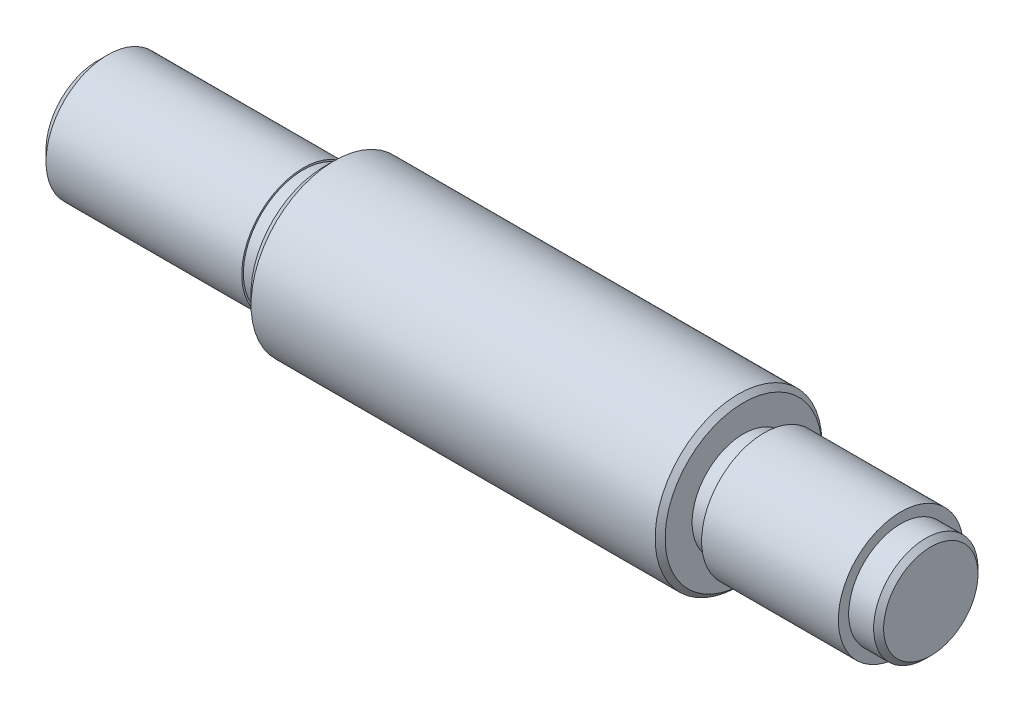
ISO-10303-21;
HEADER;
FILE_DESCRIPTION(('STEP AP214'),'2;1');
FILE_NAME('part.step','',(''),(''),'','','');
FILE_SCHEMA(('AUTOMOTIVE_DESIGN { 1 0 10303 214 1 1 1 1 }'));
ENDSEC;
DATA;
#1=APPLICATION_CONTEXT('core data for automotive mechanical design processes');
#2=APPLICATION_PROTOCOL_DEFINITION('international standard','automotive_design',2000,#1);
#3=PRODUCT_CONTEXT('',#1,'mechanical');
#4=PRODUCT('Part','Part','',(#3));
#5=PRODUCT_RELATED_PRODUCT_CATEGORY('part','',(#4));
#6=PRODUCT_DEFINITION_FORMATION('','',#4);
#7=PRODUCT_DEFINITION_CONTEXT('part definition',#1,'design');
#8=PRODUCT_DEFINITION('design','',#6,#7);
#9=PRODUCT_DEFINITION_SHAPE('','',#8);
#10=(LENGTH_UNIT() NAMED_UNIT(*) SI_UNIT(.MILLI.,.METRE.));
#11=(NAMED_UNIT(*) PLANE_ANGLE_UNIT() SI_UNIT($,.RADIAN.));
#12=(NAMED_UNIT(*) SI_UNIT($,.STERADIAN.) SOLID_ANGLE_UNIT());
#13=UNCERTAINTY_MEASURE_WITH_UNIT(LENGTH_MEASURE(1.E-05),#10,'distance_accuracy_value','');
#14=(GEOMETRIC_REPRESENTATION_CONTEXT(3) GLOBAL_UNCERTAINTY_ASSIGNED_CONTEXT((#13)) GLOBAL_UNIT_ASSIGNED_CONTEXT((#10,
#11,#12)) REPRESENTATION_CONTEXT('',''));
#15=CARTESIAN_POINT('',(0.,0.,0.));
#16=DIRECTION('',(0.,0.,1.));
#17=DIRECTION('',(1.,0.,0.));
#18=AXIS2_PLACEMENT_3D('',#15,#16,#17);
#19=CARTESIAN_POINT('',(19.05,0.,0.));
#20=DIRECTION('',(1.,0.,0.));
#21=DIRECTION('',(0.,0.,-1.));
#22=AXIS2_PLACEMENT_3D('',#19,#20,#21);
#23=CYLINDRICAL_SURFACE('',#22,4.7625);
#24=CARTESIAN_POINT('',(19.05,0.,0.));
#25=DIRECTION('',(1.,0.,0.));
#26=DIRECTION('',(0.,0.,-1.));
#27=AXIS2_PLACEMENT_3D('',#24,#25,#26);
#28=CIRCLE('',#27,4.7625);
#29=CARTESIAN_POINT('',(19.05,0.,-4.7625));
#30=VERTEX_POINT('',#29);
#31=EDGE_CURVE('E97',#30,#30,#28,.T.);
#32=ORIENTED_EDGE('',*,*,#31,.T.);
#33=EDGE_LOOP('',(#32));
#34=FACE_BOUND('',#33,.T.);
#35=CARTESIAN_POINT('',(29.464,0.,0.));
#36=DIRECTION('',(1.,0.,0.));
#37=DIRECTION('',(0.,0.,-1.));
#38=AXIS2_PLACEMENT_3D('',#35,#36,#37);
#39=CIRCLE('',#38,4.7625);
#40=CARTESIAN_POINT('',(29.464,0.,-4.7625));
#41=VERTEX_POINT('',#40);
#42=EDGE_CURVE('E102',#41,#41,#39,.T.);
#43=ORIENTED_EDGE('',*,*,#42,.F.);
#44=EDGE_LOOP('',(#43));
#45=FACE_BOUND('',#44,.T.);
#46=ADVANCED_FACE('F50',(#34,#45),#23,.T.);
#47=CARTESIAN_POINT('',(31.75,0.,0.));
#48=DIRECTION('',(-1.,0.,0.));
#49=DIRECTION('',(0.,0.,1.));
#50=AXIS2_PLACEMENT_3D('',#47,#48,#49);
#51=CYLINDRICAL_SURFACE('',#50,3.9116);
#52=CARTESIAN_POINT('',(17.4752,0.,0.));
#53=DIRECTION('',(1.,0.,0.));
#54=DIRECTION('',(0.,0.,-1.));
#55=AXIS2_PLACEMENT_3D('',#52,#53,#54);
#56=CIRCLE('',#55,3.9116);
#57=CARTESIAN_POINT('',(17.4752,0.,-3.9116));
#58=VERTEX_POINT('',#57);
#59=EDGE_CURVE('E84',#58,#58,#56,.T.);
#60=ORIENTED_EDGE('',*,*,#59,.T.);
#61=EDGE_LOOP('',(#60));
#62=FACE_BOUND('',#61,.T.);
#63=CARTESIAN_POINT('',(19.05,0.,0.));
#64=DIRECTION('',(1.,0.,0.));
#65=DIRECTION('',(0.,0.,-1.));
#66=AXIS2_PLACEMENT_3D('',#63,#64,#65);
#67=CIRCLE('',#66,3.9116);
#68=CARTESIAN_POINT('',(19.05,0.,-3.9116));
#69=VERTEX_POINT('',#68);
#70=EDGE_CURVE('E83',#69,#69,#67,.T.);
#71=ORIENTED_EDGE('',*,*,#70,.F.);
#72=EDGE_LOOP('',(#71));
#73=FACE_BOUND('',#72,.T.);
#74=ADVANCED_FACE('F118',(#62,#73),#51,.T.);
#75=CARTESIAN_POINT('',(19.05,0.,0.));
#76=DIRECTION('',(1.,0.,0.));
#77=DIRECTION('',(0.,0.,-1.));
#78=AXIS2_PLACEMENT_3D('',#75,#76,#77);
#79=PLANE('',#78);
#80=ORIENTED_EDGE('',*,*,#70,.T.);
#81=EDGE_LOOP('',(#80));
#82=FACE_BOUND('',#81,.T.);
#83=ORIENTED_EDGE('',*,*,#31,.F.);
#84=EDGE_LOOP('',(#83));
#85=FACE_BOUND('',#84,.T.);
#86=ADVANCED_FACE('F113',(#82,#85),#79,.F.);
#87=CARTESIAN_POINT('',(29.464,0.,0.));
#88=DIRECTION('',(1.,0.,0.));
#89=DIRECTION('',(0.,0.,-1.));
#90=AXIS2_PLACEMENT_3D('',#87,#88,#89);
#91=PLANE('',#90);
#92=CARTESIAN_POINT('',(29.464,0.,0.));
#93=DIRECTION('',(1.,0.,0.));
#94=DIRECTION('',(0.,0.,-1.));
#95=AXIS2_PLACEMENT_3D('',#92,#93,#94);
#96=CIRCLE('',#95,3.9751);
#97=CARTESIAN_POINT('',(29.464,0.,-3.9751));
#98=VERTEX_POINT('',#97);
#99=EDGE_CURVE('E87',#98,#98,#96,.T.);
#100=ORIENTED_EDGE('',*,*,#99,.F.);
#101=EDGE_LOOP('',(#100));
#102=FACE_BOUND('',#101,.T.);
#103=ORIENTED_EDGE('',*,*,#42,.T.);
#104=EDGE_LOOP('',(#103));
#105=FACE_BOUND('',#104,.T.);
#106=ADVANCED_FACE('F110',(#102,#105),#91,.T.);
#107=CARTESIAN_POINT('',(29.464,0.,0.));
#108=DIRECTION('',(1.,0.,0.));
#109=DIRECTION('',(0.,0.,-1.));
#110=AXIS2_PLACEMENT_3D('',#107,#108,#109);
#111=CYLINDRICAL_SURFACE('',#110,3.9751);
#112=CARTESIAN_POINT('',(31.369,0.,0.));
#113=DIRECTION('',(1.,0.,0.));
#114=DIRECTION('',(0.,0.,-1.));
#115=AXIS2_PLACEMENT_3D('',#112,#113,#114);
#116=CIRCLE('',#115,3.9751);
#117=CARTESIAN_POINT('',(31.369,0.,-3.9751));
#118=VERTEX_POINT('',#117);
#119=EDGE_CURVE('E62',#118,#118,#116,.F.);
#120=ORIENTED_EDGE('',*,*,#119,.T.);
#121=EDGE_LOOP('',(#120));
#122=FACE_BOUND('',#121,.T.);
#123=ORIENTED_EDGE('',*,*,#99,.T.);
#124=EDGE_LOOP('',(#123));
#125=FACE_BOUND('',#124,.T.);
#126=ADVANCED_FACE('F108',(#122,#125),#111,.T.);
#127=CARTESIAN_POINT('',(31.75,0.,0.));
#128=DIRECTION('',(1.,0.,0.));
#129=DIRECTION('',(0.,0.,-1.));
#130=AXIS2_PLACEMENT_3D('',#127,#128,#129);
#131=PLANE('',#130);
#132=CARTESIAN_POINT('',(31.75,0.,0.));
#133=DIRECTION('',(1.,0.,0.));
#134=DIRECTION('',(0.,0.,-1.));
#135=AXIS2_PLACEMENT_3D('',#132,#133,#134);
#136=CIRCLE('',#135,3.59410000000002);
#137=CARTESIAN_POINT('',(31.75,0.,-3.59410000000002));
#138=VERTEX_POINT('',#137);
#139=EDGE_CURVE('E66',#138,#138,#136,.T.);
#140=ORIENTED_EDGE('',*,*,#139,.T.);
#141=EDGE_LOOP('',(#140));
#142=FACE_BOUND('',#141,.T.);
#143=ADVANCED_FACE('F142',(#142),#131,.T.);
#144=CARTESIAN_POINT('',(37.0105122421383,0.,0.));
#145=DIRECTION('',(-1.,0.,0.));
#146=DIRECTION('',(0.,0.,1.));
#147=AXIS2_PLACEMENT_3D('',#144,#145,#146);
#148=CYLINDRICAL_SURFACE('',#147,6.35);
#149=CARTESIAN_POINT('',(17.0942,0.,0.));
#150=DIRECTION('',(1.,0.,0.));
#151=DIRECTION('',(0.,0.,-1.));
#152=AXIS2_PLACEMENT_3D('',#149,#150,#151);
#153=CIRCLE('',#152,6.35);
#154=CARTESIAN_POINT('',(17.0942,0.,-6.35));
#155=VERTEX_POINT('',#154);
#156=EDGE_CURVE('E14',#155,#155,#153,.F.);
#157=ORIENTED_EDGE('',*,*,#156,.T.);
#158=EDGE_LOOP('',(#157));
#159=FACE_BOUND('',#158,.T.);
#160=CARTESIAN_POINT('',(-13.6906,0.,0.));
#161=DIRECTION('',(1.,0.,0.));
#162=DIRECTION('',(0.,0.,-1.));
#163=AXIS2_PLACEMENT_3D('',#160,#161,#162);
#164=CIRCLE('',#163,6.35);
#165=CARTESIAN_POINT('',(-13.6906,0.,-6.35));
#166=VERTEX_POINT('',#165);
#167=EDGE_CURVE('E80',#166,#166,#164,.T.);
#168=ORIENTED_EDGE('',*,*,#167,.T.);
#169=EDGE_LOOP('',(#168));
#170=FACE_BOUND('',#169,.T.);
#171=ADVANCED_FACE('F145',(#159,#170),#148,.T.);
#172=CARTESIAN_POINT('',(-14.478,0.,0.));
#173=DIRECTION('',(1.,0.,0.));
#174=DIRECTION('',(0.,0.,-1.));
#175=AXIS2_PLACEMENT_3D('',#172,#173,#174);
#176=PLANE('',#175);
#177=CARTESIAN_POINT('',(-14.478,0.,0.));
#178=DIRECTION('',(1.,0.,0.));
#179=DIRECTION('',(0.,0.,-1.));
#180=AXIS2_PLACEMENT_3D('',#177,#178,#179);
#181=CIRCLE('',#180,5.56259999999999);
#182=CARTESIAN_POINT('',(-14.478,0.,-5.56259999999999));
#183=VERTEX_POINT('',#182);
#184=EDGE_CURVE('E77',#183,#183,#181,.F.);
#185=ORIENTED_EDGE('',*,*,#184,.T.);
#186=EDGE_LOOP('',(#185));
#187=FACE_BOUND('',#186,.T.);
#188=CARTESIAN_POINT('',(-14.478,0.,0.));
#189=DIRECTION('',(1.,0.,0.));
#190=DIRECTION('',(0.,0.,-1.));
#191=AXIS2_PLACEMENT_3D('',#188,#189,#190);
#192=CIRCLE('',#191,4.572);
#193=CARTESIAN_POINT('',(-14.478,0.,-4.572));
#194=VERTEX_POINT('',#193);
#195=EDGE_CURVE('E94',#194,#194,#192,.T.);
#196=ORIENTED_EDGE('',*,*,#195,.T.);
#197=EDGE_LOOP('',(#196));
#198=FACE_BOUND('',#197,.T.);
#199=ADVANCED_FACE('F184',(#187,#198),#176,.F.);
#200=CARTESIAN_POINT('',(17.4752,0.,0.));
#201=DIRECTION('',(1.,0.,0.));
#202=DIRECTION('',(0.,0.,-1.));
#203=AXIS2_PLACEMENT_3D('',#200,#201,#202);
#204=PLANE('',#203);
#205=CARTESIAN_POINT('',(17.4752,0.,0.));
#206=DIRECTION('',(1.,0.,0.));
#207=DIRECTION('',(0.,0.,-1.));
#208=AXIS2_PLACEMENT_3D('',#205,#206,#207);
#209=CIRCLE('',#208,5.96899999999999);
#210=CARTESIAN_POINT('',(17.4752,0.,-5.96899999999999));
#211=VERTEX_POINT('',#210);
#212=EDGE_CURVE('E58',#211,#211,#209,.T.);
#213=ORIENTED_EDGE('',*,*,#212,.T.);
#214=EDGE_LOOP('',(#213));
#215=FACE_BOUND('',#214,.T.);
#216=ORIENTED_EDGE('',*,*,#59,.F.);
#217=EDGE_LOOP('',(#216));
#218=FACE_BOUND('',#217,.T.);
#219=ADVANCED_FACE('F148',(#215,#218),#204,.T.);
#220=CARTESIAN_POINT('',(-31.75,0.,0.));
#221=DIRECTION('',(1.,0.,0.));
#222=DIRECTION('',(0.,0.,-1.));
#223=AXIS2_PLACEMENT_3D('',#220,#221,#222);
#224=PLANE('',#223);
#225=CARTESIAN_POINT('',(-31.75,0.,0.));
#226=DIRECTION('',(1.,0.,0.));
#227=DIRECTION('',(0.,0.,-1.));
#228=AXIS2_PLACEMENT_3D('',#225,#226,#227);
#229=CIRCLE('',#228,3.9116);
#230=CARTESIAN_POINT('',(-31.75,0.,-3.9116));
#231=VERTEX_POINT('',#230);
#232=EDGE_CURVE('E74',#231,#231,#229,.F.);
#233=ORIENTED_EDGE('',*,*,#232,.T.);
#234=EDGE_LOOP('',(#233));
#235=FACE_BOUND('',#234,.T.);
#236=ADVANCED_FACE('F140',(#235),#224,.F.);
#237=CARTESIAN_POINT('',(-14.478,0.,0.));
#238=DIRECTION('',(-1.,0.,0.));
#239=DIRECTION('',(0.,0.,1.));
#240=AXIS2_PLACEMENT_3D('',#237,#238,#239);
#241=CYLINDRICAL_SURFACE('',#240,4.699);
#242=CARTESIAN_POINT('',(-30.9626,0.,0.));
#243=DIRECTION('',(1.,0.,0.));
#244=DIRECTION('',(0.,0.,-1.));
#245=AXIS2_PLACEMENT_3D('',#242,#243,#244);
#246=CIRCLE('',#245,4.699);
#247=CARTESIAN_POINT('',(-30.9626,0.,-4.699));
#248=VERTEX_POINT('',#247);
#249=EDGE_CURVE('E71',#248,#248,#246,.T.);
#250=ORIENTED_EDGE('',*,*,#249,.T.);
#251=EDGE_LOOP('',(#250));
#252=FACE_BOUND('',#251,.T.);
#253=CARTESIAN_POINT('',(-16.0528,0.,0.));
#254=DIRECTION('',(1.,0.,0.));
#255=DIRECTION('',(0.,0.,-1.));
#256=AXIS2_PLACEMENT_3D('',#253,#254,#255);
#257=CIRCLE('',#256,4.699);
#258=CARTESIAN_POINT('',(-16.0528,0.,-4.699));
#259=VERTEX_POINT('',#258);
#260=EDGE_CURVE('E90',#259,#259,#257,.T.);
#261=ORIENTED_EDGE('',*,*,#260,.F.);
#262=EDGE_LOOP('',(#261));
#263=FACE_BOUND('',#262,.T.);
#264=ADVANCED_FACE('F136',(#252,#263),#241,.T.);
#265=CARTESIAN_POINT('',(-16.0528,0.,0.));
#266=DIRECTION('',(1.,0.,0.));
#267=DIRECTION('',(0.,0.,-1.));
#268=AXIS2_PLACEMENT_3D('',#265,#266,#267);
#269=PLANE('',#268);
#270=CARTESIAN_POINT('',(-16.0528,0.,0.));
#271=DIRECTION('',(1.,0.,0.));
#272=DIRECTION('',(0.,0.,-1.));
#273=AXIS2_PLACEMENT_3D('',#270,#271,#272);
#274=CIRCLE('',#273,4.572);
#275=CARTESIAN_POINT('',(-16.0528,0.,-4.572));
#276=VERTEX_POINT('',#275);
#277=EDGE_CURVE('E93',#276,#276,#274,.T.);
#278=ORIENTED_EDGE('',*,*,#277,.F.);
#279=EDGE_LOOP('',(#278));
#280=FACE_BOUND('',#279,.T.);
#281=ORIENTED_EDGE('',*,*,#260,.T.);
#282=EDGE_LOOP('',(#281));
#283=FACE_BOUND('',#282,.T.);
#284=ADVANCED_FACE('F132',(#280,#283),#269,.T.);
#285=CARTESIAN_POINT('',(-16.0528,0.,0.));
#286=DIRECTION('',(1.,0.,0.));
#287=DIRECTION('',(0.,0.,-1.));
#288=AXIS2_PLACEMENT_3D('',#285,#286,#287);
#289=CYLINDRICAL_SURFACE('',#288,4.572);
#290=ORIENTED_EDGE('',*,*,#277,.T.);
#291=EDGE_LOOP('',(#290));
#292=FACE_BOUND('',#291,.T.);
#293=ORIENTED_EDGE('',*,*,#195,.F.);
#294=EDGE_LOOP('',(#293));
#295=FACE_BOUND('',#294,.T.);
#296=ADVANCED_FACE('F128',(#292,#295),#289,.T.);
#297=CARTESIAN_POINT('',(-13.6906,0.,0.));
#298=DIRECTION('',(1.,0.,0.));
#299=DIRECTION('',(0.,0.,-1.));
#300=AXIS2_PLACEMENT_3D('',#297,#298,#299);
#301=CONICAL_SURFACE('',#300,6.35,0.785398163397443);
#302=CARTESIAN_POINT('',(-14.478,0.,-5.56259999999999));
#303=CARTESIAN_POINT('',(-14.4697979166667,0.,-5.57080208333332));
#304=CARTESIAN_POINT('',(-14.4615958333333,0.,-5.57900416666665));
#305=CARTESIAN_POINT('',(-14.4451916666667,0.,-5.59540833333332));
#306=CARTESIAN_POINT('',(-14.4369895833333,0.,-5.60361041666666));
#307=CARTESIAN_POINT('',(-14.4205854166667,0.,-5.62001458333332));
#308=CARTESIAN_POINT('',(-14.4123833333333,0.,-5.62821666666666));
#309=CARTESIAN_POINT('',(-14.3959791666667,0.,-5.64462083333332));
#310=CARTESIAN_POINT('',(-14.3877770833333,0.,-5.65282291666666));
#311=CARTESIAN_POINT('',(-14.3713729166667,0.,-5.66922708333332));
#312=CARTESIAN_POINT('',(-14.3631708333333,0.,-5.67742916666666));
#313=CARTESIAN_POINT('',(-14.3467666666667,0.,-5.69383333333332));
#314=CARTESIAN_POINT('',(-14.3385645833333,0.,-5.70203541666666));
#315=CARTESIAN_POINT('',(-14.3221604166667,0.,-5.71843958333332));
#316=CARTESIAN_POINT('',(-14.3139583333333,0.,-5.72664166666666));
#317=CARTESIAN_POINT('',(-14.2975541666667,0.,-5.74304583333332));
#318=CARTESIAN_POINT('',(-14.2893520833333,0.,-5.75124791666666));
#319=CARTESIAN_POINT('',(-14.2729479166667,0.,-5.76765208333333));
#320=CARTESIAN_POINT('',(-14.2647458333333,0.,-5.77585416666666));
#321=CARTESIAN_POINT('',(-14.2483416666667,0.,-5.79225833333332));
#322=CARTESIAN_POINT('',(-14.2401395833333,0.,-5.80046041666666));
#323=CARTESIAN_POINT('',(-14.2237354166667,0.,-5.81686458333332));
#324=CARTESIAN_POINT('',(-14.2155333333333,0.,-5.82506666666666));
#325=CARTESIAN_POINT('',(-14.1991291666667,0.,-5.84147083333333));
#326=CARTESIAN_POINT('',(-14.1909270833333,0.,-5.84967291666666));
#327=CARTESIAN_POINT('',(-14.1745229166667,0.,-5.86607708333333));
#328=CARTESIAN_POINT('',(-14.1663208333333,0.,-5.87427916666666));
#329=CARTESIAN_POINT('',(-14.1499166666667,0.,-5.89068333333333));
#330=CARTESIAN_POINT('',(-14.1417145833333,0.,-5.89888541666666));
#331=CARTESIAN_POINT('',(-14.1253104166667,0.,-5.91528958333333));
#332=CARTESIAN_POINT('',(-14.1171083333333,0.,-5.92349166666666));
#333=CARTESIAN_POINT('',(-14.1007041666667,0.,-5.93989583333333));
#334=CARTESIAN_POINT('',(-14.0925020833333,0.,-5.94809791666666));
#335=CARTESIAN_POINT('',(-14.0760979166667,0.,-5.96450208333333));
#336=CARTESIAN_POINT('',(-14.0678958333333,0.,-5.97270416666666));
#337=CARTESIAN_POINT('',(-14.0514916666667,0.,-5.98910833333333));
#338=CARTESIAN_POINT('',(-14.0432895833333,0.,-5.99731041666666));
#339=CARTESIAN_POINT('',(-14.0268854166667,0.,-6.01371458333333));
#340=CARTESIAN_POINT('',(-14.0186833333333,0.,-6.02191666666666));
#341=CARTESIAN_POINT('',(-14.0022791666667,0.,-6.03832083333333));
#342=CARTESIAN_POINT('',(-13.9940770833333,0.,-6.04652291666666));
#343=CARTESIAN_POINT('',(-13.9776729166667,0.,-6.06292708333333));
#344=CARTESIAN_POINT('',(-13.9694708333333,0.,-6.07112916666666));
#345=CARTESIAN_POINT('',(-13.9530666666667,0.,-6.08753333333333));
#346=CARTESIAN_POINT('',(-13.9448645833333,0.,-6.09573541666666));
#347=CARTESIAN_POINT('',(-13.9284604166667,0.,-6.11213958333333));
#348=CARTESIAN_POINT('',(-13.9202583333333,0.,-6.12034166666666));
#349=CARTESIAN_POINT('',(-13.9038541666667,0.,-6.13674583333333));
#350=CARTESIAN_POINT('',(-13.8956520833333,0.,-6.14494791666666));
#351=CARTESIAN_POINT('',(-13.8792479166667,0.,-6.16135208333333));
#352=CARTESIAN_POINT('',(-13.8710458333333,0.,-6.16955416666666));
#353=CARTESIAN_POINT('',(-13.8546416666667,0.,-6.18595833333333));
#354=CARTESIAN_POINT('',(-13.8464395833333,0.,-6.19416041666666));
#355=CARTESIAN_POINT('',(-13.8300354166667,0.,-6.21056458333333));
#356=CARTESIAN_POINT('',(-13.8218333333333,0.,-6.21876666666666));
#357=CARTESIAN_POINT('',(-13.8054291666667,0.,-6.23517083333333));
#358=CARTESIAN_POINT('',(-13.7972270833333,0.,-6.24337291666666));
#359=CARTESIAN_POINT('',(-13.7808229166667,0.,-6.25977708333333));
#360=CARTESIAN_POINT('',(-13.7726208333333,0.,-6.26797916666666));
#361=CARTESIAN_POINT('',(-13.7562166666667,0.,-6.28438333333333));
#362=CARTESIAN_POINT('',(-13.7480145833333,0.,-6.29258541666666));
#363=CARTESIAN_POINT('',(-13.7316104166667,0.,-6.30898958333333));
#364=CARTESIAN_POINT('',(-13.7234083333333,0.,-6.31719166666667));
#365=CARTESIAN_POINT('',(-13.7070041666667,0.,-6.33359583333333));
#366=CARTESIAN_POINT('',(-13.6988020833333,0.,-6.34179791666667));
#367=CARTESIAN_POINT('',(-13.6906,0.,-6.35));
#368=B_SPLINE_CURVE_WITH_KNOTS('',3,(#302,#303,#304,#305,#306,#307,#308,#309,#310,#311,#312,
#313,#314,#315,#316,#317,#318,#319,#320,#321,#322,#323,#324,#325,#326,#327,#328,#329,#330,#331,
#332,#333,#334,#335,#336,#337,#338,#339,#340,#341,#342,#343,#344,#345,#346,#347,#348,#349,#350,
#351,#352,#353,#354,#355,#356,#357,#358,#359,#360,#361,#362,#363,#364,#365,#366,#367),
.UNSPECIFIED.,.F.,.F.,(4,2,2,2,2,2,2,2,2,2,2,2,2,2,2,2,2,2,2,2,2,2,2,2,2,2,2,2,2,2,2,2,4),(0.,
0.0347984924691439,0.0695969849382872,0.104395477407432,0.139193969876574,0.173992462345719,
0.208790954814862,0.243589447284006,0.278387939753149,0.313186432222292,0.347984924691437,
0.382783417160579,0.417581909629724,0.452380402098867,0.487178894568011,0.521977387037154,
0.556775879506297,0.591574371975441,0.626372864444585,0.661171356913729,0.695969849382872,
0.730768341852016,0.765566834321159,0.800365326790304,0.835163819259446,0.86996231172859,
0.904760804197734,0.939559296666877,0.974357789136022,1.00915628160516,1.04395477407431,
1.07875326654345,1.1135517590126),.UNSPECIFIED.);
#369=EDGE_CURVE('BSEAM131',#183,#166,#368,.T.);
#370=ORIENTED_EDGE('',*,*,#184,.F.);
#371=ORIENTED_EDGE('',*,*,#167,.F.);
#372=ORIENTED_EDGE('',*,*,#369,.T.);
#373=ORIENTED_EDGE('',*,*,#369,.F.);
#374=EDGE_LOOP('',(#370,#372,#371,#373));
#375=FACE_BOUND('',#374,.T.);
#376=ADVANCED_FACE('F131',(#375),#301,.T.);
#377=CARTESIAN_POINT('',(-31.75,0.,0.));
#378=DIRECTION('',(1.,0.,0.));
#379=DIRECTION('',(0.,0.,-1.));
#380=AXIS2_PLACEMENT_3D('',#377,#378,#379);
#381=CONICAL_SURFACE('',#380,3.9116,0.785398163397452);
#382=ORIENTED_EDGE('',*,*,#249,.F.);
#383=EDGE_LOOP('',(#382));
#384=FACE_BOUND('',#383,.T.);
#385=ORIENTED_EDGE('',*,*,#232,.F.);
#386=EDGE_LOOP('',(#385));
#387=FACE_BOUND('',#386,.T.);
#388=ADVANCED_FACE('F157',(#384,#387),#381,.T.);
#389=CARTESIAN_POINT('',(31.75,0.,0.));
#390=DIRECTION('',(-1.,0.,0.));
#391=DIRECTION('',(0.,0.,1.));
#392=AXIS2_PLACEMENT_3D('',#389,#390,#391);
#393=CONICAL_SURFACE('',#392,3.59410000000002,0.785398163397445);
#394=ORIENTED_EDGE('',*,*,#119,.F.);
#395=EDGE_LOOP('',(#394));
#396=FACE_BOUND('',#395,.T.);
#397=ORIENTED_EDGE('',*,*,#139,.F.);
#398=EDGE_LOOP('',(#397));
#399=FACE_BOUND('',#398,.T.);
#400=ADVANCED_FACE('F163',(#396,#399),#393,.T.);
#401=CARTESIAN_POINT('',(17.4752,0.,0.));
#402=DIRECTION('',(-1.,0.,0.));
#403=DIRECTION('',(0.,0.,1.));
#404=AXIS2_PLACEMENT_3D('',#401,#402,#403);
#405=CONICAL_SURFACE('',#404,5.96899999999999,0.785398163397446);
#406=ORIENTED_EDGE('',*,*,#156,.F.);
#407=EDGE_LOOP('',(#406));
#408=FACE_BOUND('',#407,.T.);
#409=ORIENTED_EDGE('',*,*,#212,.F.);
#410=EDGE_LOOP('',(#409));
#411=FACE_BOUND('',#410,.T.);
#412=ADVANCED_FACE('F53',(#408,#411),#405,.T.);
#413=CLOSED_SHELL('',(#46,#74,#86,#106,#126,#143,#171,#199,#219,#236,#264,#284,#296,#376,#388,
#400,#412));
#414=MANIFOLD_SOLID_BREP('B2',#413);
#415=ADVANCED_BREP_SHAPE_REPRESENTATION('',(#18,#414),#14);
#416=SHAPE_DEFINITION_REPRESENTATION(#9,#415);
ENDSEC;
END-ISO-10303-21;
